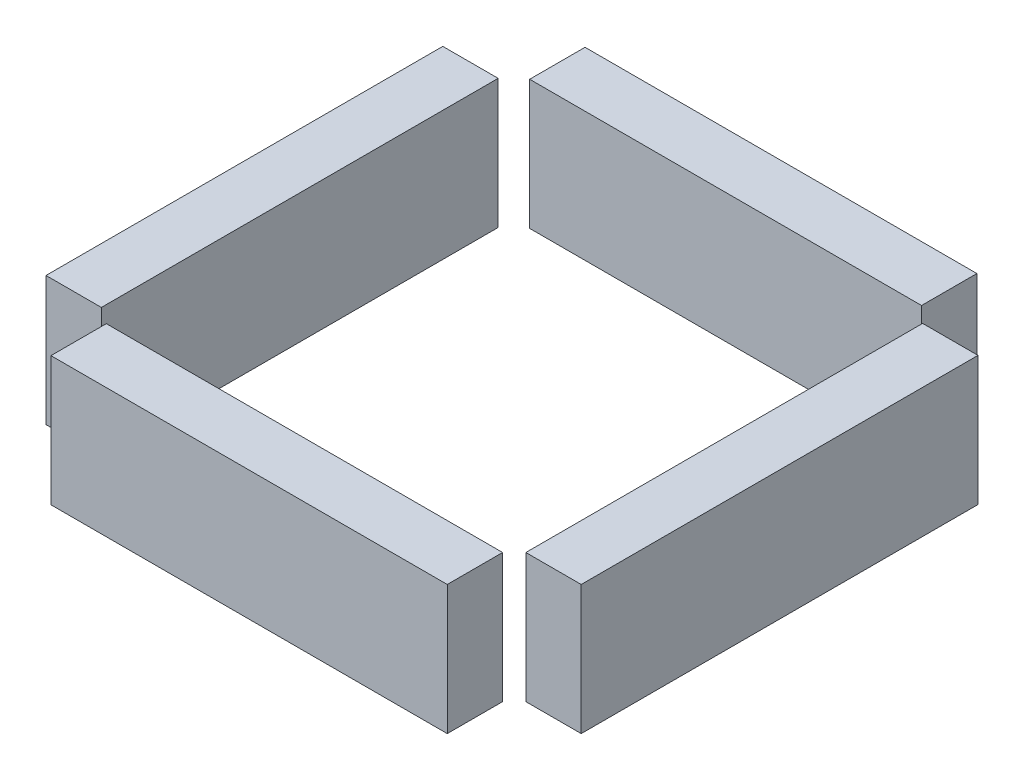
ISO-10303-21;
HEADER;
FILE_DESCRIPTION(('STEP AP214'),'2;1');
FILE_NAME('part.step','',(''),(''),'','','');
FILE_SCHEMA(('AUTOMOTIVE_DESIGN { 1 0 10303 214 1 1 1 1 }'));
ENDSEC;
DATA;
#1=APPLICATION_CONTEXT('core data for automotive mechanical design processes');
#2=APPLICATION_PROTOCOL_DEFINITION('international standard','automotive_design',2000,#1);
#3=PRODUCT_CONTEXT('',#1,'mechanical');
#4=PRODUCT('Part','Part','',(#3));
#5=PRODUCT_RELATED_PRODUCT_CATEGORY('part','',(#4));
#6=PRODUCT_DEFINITION_FORMATION('','',#4);
#7=PRODUCT_DEFINITION_CONTEXT('part definition',#1,'design');
#8=PRODUCT_DEFINITION('design','',#6,#7);
#9=PRODUCT_DEFINITION_SHAPE('','',#8);
#10=(LENGTH_UNIT() NAMED_UNIT(*) SI_UNIT(.MILLI.,.METRE.));
#11=(NAMED_UNIT(*) PLANE_ANGLE_UNIT() SI_UNIT($,.RADIAN.));
#12=(NAMED_UNIT(*) SI_UNIT($,.STERADIAN.) SOLID_ANGLE_UNIT());
#13=UNCERTAINTY_MEASURE_WITH_UNIT(LENGTH_MEASURE(1.E-05),#10,'distance_accuracy_value','');
#14=(GEOMETRIC_REPRESENTATION_CONTEXT(3) GLOBAL_UNCERTAINTY_ASSIGNED_CONTEXT((#13)) GLOBAL_UNIT_ASSIGNED_CONTEXT((#10,
#11,#12)) REPRESENTATION_CONTEXT('',''));
#15=CARTESIAN_POINT('',(0.,0.,0.));
#16=DIRECTION('',(0.,0.,1.));
#17=DIRECTION('',(1.,0.,0.));
#18=AXIS2_PLACEMENT_3D('',#15,#16,#17);
#19=CARTESIAN_POINT('',(45.5913386514758,14.,-76.0118904115382));
#20=DIRECTION('',(1.,0.,0.));
#21=DIRECTION('',(0.,0.,-1.));
#22=AXIS2_PLACEMENT_3D('',#19,#20,#21);
#23=PLANE('',#22);
#24=DIRECTION('',(0.,0.,1.));
#25=VECTOR('',#24,1.);
#26=CARTESIAN_POINT('',(45.5913386514758,0.,-76.0118904115382));
#27=LINE('',#26,#25);
#28=CARTESIAN_POINT('',(45.5913386514758,0.,-76.0118904115382));
#29=VERTEX_POINT('',#28);
#30=CARTESIAN_POINT('',(45.5913386514758,0.,-70.0118904115382));
#31=VERTEX_POINT('',#30);
#32=EDGE_CURVE('E107',#29,#31,#27,.T.);
#33=ORIENTED_EDGE('',*,*,#32,.T.);
#34=DIRECTION('',(0.,-1.,0.));
#35=VECTOR('',#34,1.);
#36=CARTESIAN_POINT('',(45.5913386514758,14.,-70.0118904115382));
#37=LINE('',#36,#35);
#38=CARTESIAN_POINT('',(45.5913386514758,14.,-70.0118904115382));
#39=VERTEX_POINT('',#38);
#40=EDGE_CURVE('E12',#39,#31,#37,.T.);
#41=ORIENTED_EDGE('',*,*,#40,.F.);
#42=DIRECTION('',(0.,0.,1.));
#43=VECTOR('',#42,1.);
#44=CARTESIAN_POINT('',(45.5913386514758,14.,-76.0118904115382));
#45=LINE('',#44,#43);
#46=CARTESIAN_POINT('',(45.5913386514758,14.,-76.0118904115382));
#47=VERTEX_POINT('',#46);
#48=EDGE_CURVE('E95',#47,#39,#45,.T.);
#49=ORIENTED_EDGE('',*,*,#48,.F.);
#50=DIRECTION('',(0.,-1.,0.));
#51=VECTOR('',#50,1.);
#52=CARTESIAN_POINT('',(45.5913386514758,14.,-76.0118904115382));
#53=LINE('',#52,#51);
#54=EDGE_CURVE('E103',#47,#29,#53,.T.);
#55=ORIENTED_EDGE('',*,*,#54,.T.);
#56=EDGE_LOOP('',(#33,#41,#49,#55));
#57=FACE_BOUND('',#56,.T.);
#58=ADVANCED_FACE('F44',(#57),#23,.F.);
#59=CARTESIAN_POINT('',(45.5913386514758,14.,-70.0118904115382));
#60=DIRECTION('',(0.,0.,-1.));
#61=DIRECTION('',(-1.,0.,0.));
#62=AXIS2_PLACEMENT_3D('',#59,#60,#61);
#63=PLANE('',#62);
#64=DIRECTION('',(1.,0.,0.));
#65=VECTOR('',#64,1.);
#66=CARTESIAN_POINT('',(45.5913386514758,0.,-70.0118904115382));
#67=LINE('',#66,#65);
#68=CARTESIAN_POINT('',(88.0565955094808,0.,-70.0118904115382));
#69=VERTEX_POINT('',#68);
#70=EDGE_CURVE('E99',#31,#69,#67,.T.);
#71=ORIENTED_EDGE('',*,*,#70,.T.);
#72=DIRECTION('',(0.,-1.,0.));
#73=VECTOR('',#72,1.);
#74=CARTESIAN_POINT('',(88.0565955094808,14.,-70.0118904115382));
#75=LINE('',#74,#73);
#76=CARTESIAN_POINT('',(88.0565955094808,14.,-70.0118904115382));
#77=VERTEX_POINT('',#76);
#78=EDGE_CURVE('E52',#77,#69,#75,.T.);
#79=ORIENTED_EDGE('',*,*,#78,.F.);
#80=DIRECTION('',(1.,0.,0.));
#81=VECTOR('',#80,1.);
#82=CARTESIAN_POINT('',(45.5913386514758,14.,-70.0118904115382));
#83=LINE('',#82,#81);
#84=EDGE_CURVE('E90',#39,#77,#83,.T.);
#85=ORIENTED_EDGE('',*,*,#84,.F.);
#86=ORIENTED_EDGE('',*,*,#40,.T.);
#87=EDGE_LOOP('',(#71,#79,#85,#86));
#88=FACE_BOUND('',#87,.T.);
#89=ADVANCED_FACE('F98',(#88),#63,.F.);
#90=CARTESIAN_POINT('',(88.0565955094808,14.,-76.0118904115382));
#91=DIRECTION('',(-1.,0.,0.));
#92=DIRECTION('',(0.,0.,1.));
#93=AXIS2_PLACEMENT_3D('',#90,#91,#92);
#94=PLANE('',#93);
#95=DIRECTION('',(0.,0.,-1.));
#96=VECTOR('',#95,1.);
#97=CARTESIAN_POINT('',(88.0565955094808,0.,-76.0118904115382));
#98=LINE('',#97,#96);
#99=CARTESIAN_POINT('',(88.0565955094808,0.,-76.0118904115382));
#100=VERTEX_POINT('',#99);
#101=EDGE_CURVE('E77',#69,#100,#98,.T.);
#102=ORIENTED_EDGE('',*,*,#101,.T.);
#103=DIRECTION('',(0.,-1.,0.));
#104=VECTOR('',#103,1.);
#105=CARTESIAN_POINT('',(88.0565955094808,14.,-76.0118904115382));
#106=LINE('',#105,#104);
#107=CARTESIAN_POINT('',(88.0565955094808,14.,-76.0118904115382));
#108=VERTEX_POINT('',#107);
#109=EDGE_CURVE('E100',#108,#100,#106,.T.);
#110=ORIENTED_EDGE('',*,*,#109,.F.);
#111=DIRECTION('',(0.,0.,-1.));
#112=VECTOR('',#111,1.);
#113=CARTESIAN_POINT('',(88.0565955094808,14.,-76.0118904115382));
#114=LINE('',#113,#112);
#115=EDGE_CURVE('E93',#77,#108,#114,.T.);
#116=ORIENTED_EDGE('',*,*,#115,.F.);
#117=ORIENTED_EDGE('',*,*,#78,.T.);
#118=EDGE_LOOP('',(#102,#110,#116,#117));
#119=FACE_BOUND('',#118,.T.);
#120=ADVANCED_FACE('F101',(#119),#94,.F.);
#121=CARTESIAN_POINT('',(45.5913386514758,14.,-76.0118904115382));
#122=DIRECTION('',(0.,0.,1.));
#123=DIRECTION('',(1.,0.,0.));
#124=AXIS2_PLACEMENT_3D('',#121,#122,#123);
#125=PLANE('',#124);
#126=DIRECTION('',(-1.,0.,0.));
#127=VECTOR('',#126,1.);
#128=CARTESIAN_POINT('',(45.5913386514758,0.,-76.0118904115382));
#129=LINE('',#128,#127);
#130=EDGE_CURVE('E83',#100,#29,#129,.T.);
#131=ORIENTED_EDGE('',*,*,#130,.T.);
#132=ORIENTED_EDGE('',*,*,#54,.F.);
#133=DIRECTION('',(-1.,0.,0.));
#134=VECTOR('',#133,1.);
#135=CARTESIAN_POINT('',(45.5913386514758,14.,-76.0118904115382));
#136=LINE('',#135,#134);
#137=EDGE_CURVE('E60',#108,#47,#136,.T.);
#138=ORIENTED_EDGE('',*,*,#137,.F.);
#139=ORIENTED_EDGE('',*,*,#109,.T.);
#140=EDGE_LOOP('',(#131,#132,#138,#139));
#141=FACE_BOUND('',#140,.T.);
#142=ADVANCED_FACE('F114',(#141),#125,.F.);
#143=CARTESIAN_POINT('',(45.5913386514758,14.,-70.0118904115382));
#144=DIRECTION('',(0.,1.,0.));
#145=DIRECTION('',(0.,0.,1.));
#146=AXIS2_PLACEMENT_3D('',#143,#144,#145);
#147=PLANE('',#146);
#148=ORIENTED_EDGE('',*,*,#48,.T.);
#149=ORIENTED_EDGE('',*,*,#84,.T.);
#150=ORIENTED_EDGE('',*,*,#115,.T.);
#151=ORIENTED_EDGE('',*,*,#137,.T.);
#152=EDGE_LOOP('',(#148,#149,#150,#151));
#153=FACE_BOUND('',#152,.T.);
#154=ADVANCED_FACE('F91',(#153),#147,.T.);
#155=CARTESIAN_POINT('',(45.5913386514758,0.,-70.0118904115382));
#156=DIRECTION('',(0.,1.,0.));
#157=DIRECTION('',(0.,0.,1.));
#158=AXIS2_PLACEMENT_3D('',#155,#156,#157);
#159=PLANE('',#158);
#160=ORIENTED_EDGE('',*,*,#32,.F.);
#161=ORIENTED_EDGE('',*,*,#130,.F.);
#162=ORIENTED_EDGE('',*,*,#101,.F.);
#163=ORIENTED_EDGE('',*,*,#70,.F.);
#164=EDGE_LOOP('',(#160,#161,#162,#163));
#165=FACE_BOUND('',#164,.T.);
#166=ADVANCED_FACE('F117',(#165),#159,.F.);
#167=CLOSED_SHELL('',(#58,#89,#120,#142,#154,#166));
#168=MANIFOLD_SOLID_BREP('B2',#167);
#169=CARTESIAN_POINT('',(45.5913386514758,14.,-24.1324555266718));
#170=DIRECTION('',(1.,0.,0.));
#171=DIRECTION('',(0.,0.,-1.));
#172=AXIS2_PLACEMENT_3D('',#169,#170,#171);
#173=PLANE('',#172);
#174=DIRECTION('',(0.,0.,1.));
#175=VECTOR('',#174,1.);
#176=CARTESIAN_POINT('',(45.5913386514758,0.,-24.1324555266718));
#177=LINE('',#176,#175);
#178=CARTESIAN_POINT('',(45.5913386514758,0.,-24.1324555266718));
#179=VERTEX_POINT('',#178);
#180=CARTESIAN_POINT('',(45.5913386514758,0.,-18.1324555266718));
#181=VERTEX_POINT('',#180);
#182=EDGE_CURVE('E241',#179,#181,#177,.T.);
#183=ORIENTED_EDGE('',*,*,#182,.T.);
#184=DIRECTION('',(0.,-1.,0.));
#185=VECTOR('',#184,1.);
#186=CARTESIAN_POINT('',(45.5913386514758,14.,-18.1324555266718));
#187=LINE('',#186,#185);
#188=CARTESIAN_POINT('',(45.5913386514758,14.,-18.1324555266718));
#189=VERTEX_POINT('',#188);
#190=EDGE_CURVE('E42',#189,#181,#187,.T.);
#191=ORIENTED_EDGE('',*,*,#190,.F.);
#192=DIRECTION('',(0.,0.,1.));
#193=VECTOR('',#192,1.);
#194=CARTESIAN_POINT('',(45.5913386514758,14.,-24.1324555266718));
#195=LINE('',#194,#193);
#196=CARTESIAN_POINT('',(45.5913386514758,14.,-24.1324555266718));
#197=VERTEX_POINT('',#196);
#198=EDGE_CURVE('E229',#197,#189,#195,.T.);
#199=ORIENTED_EDGE('',*,*,#198,.F.);
#200=DIRECTION('',(0.,-1.,0.));
#201=VECTOR('',#200,1.);
#202=CARTESIAN_POINT('',(45.5913386514758,14.,-24.1324555266718));
#203=LINE('',#202,#201);
#204=EDGE_CURVE('E237',#197,#179,#203,.T.);
#205=ORIENTED_EDGE('',*,*,#204,.T.);
#206=EDGE_LOOP('',(#183,#191,#199,#205));
#207=FACE_BOUND('',#206,.T.);
#208=ADVANCED_FACE('F178',(#207),#173,.F.);
#209=CARTESIAN_POINT('',(45.5913386514758,14.,-18.1324555266718));
#210=DIRECTION('',(0.,0.,-1.));
#211=DIRECTION('',(-1.,0.,0.));
#212=AXIS2_PLACEMENT_3D('',#209,#210,#211);
#213=PLANE('',#212);
#214=DIRECTION('',(1.,0.,0.));
#215=VECTOR('',#214,1.);
#216=CARTESIAN_POINT('',(45.5913386514758,0.,-18.1324555266718));
#217=LINE('',#216,#215);
#218=CARTESIAN_POINT('',(88.5391552465036,0.,-18.1324555266718));
#219=VERTEX_POINT('',#218);
#220=EDGE_CURVE('E233',#181,#219,#217,.T.);
#221=ORIENTED_EDGE('',*,*,#220,.T.);
#222=DIRECTION('',(0.,-1.,0.));
#223=VECTOR('',#222,1.);
#224=CARTESIAN_POINT('',(88.5391552465036,14.,-18.1324555266718));
#225=LINE('',#224,#223);
#226=CARTESIAN_POINT('',(88.5391552465036,14.,-18.1324555266718));
#227=VERTEX_POINT('',#226);
#228=EDGE_CURVE('E186',#227,#219,#225,.T.);
#229=ORIENTED_EDGE('',*,*,#228,.F.);
#230=DIRECTION('',(1.,0.,0.));
#231=VECTOR('',#230,1.);
#232=CARTESIAN_POINT('',(45.5913386514758,14.,-18.1324555266718));
#233=LINE('',#232,#231);
#234=EDGE_CURVE('E224',#189,#227,#233,.T.);
#235=ORIENTED_EDGE('',*,*,#234,.F.);
#236=ORIENTED_EDGE('',*,*,#190,.T.);
#237=EDGE_LOOP('',(#221,#229,#235,#236));
#238=FACE_BOUND('',#237,.T.);
#239=ADVANCED_FACE('F232',(#238),#213,.F.);
#240=CARTESIAN_POINT('',(88.5391552465036,14.,-24.1324555266718));
#241=DIRECTION('',(-1.,0.,0.));
#242=DIRECTION('',(0.,0.,1.));
#243=AXIS2_PLACEMENT_3D('',#240,#241,#242);
#244=PLANE('',#243);
#245=DIRECTION('',(0.,0.,-1.));
#246=VECTOR('',#245,1.);
#247=CARTESIAN_POINT('',(88.5391552465036,0.,-24.1324555266718));
#248=LINE('',#247,#246);
#249=CARTESIAN_POINT('',(88.5391552465036,0.,-24.1324555266718));
#250=VERTEX_POINT('',#249);
#251=EDGE_CURVE('E211',#219,#250,#248,.T.);
#252=ORIENTED_EDGE('',*,*,#251,.T.);
#253=DIRECTION('',(0.,-1.,0.));
#254=VECTOR('',#253,1.);
#255=CARTESIAN_POINT('',(88.5391552465036,14.,-24.1324555266718));
#256=LINE('',#255,#254);
#257=CARTESIAN_POINT('',(88.5391552465036,14.,-24.1324555266718));
#258=VERTEX_POINT('',#257);
#259=EDGE_CURVE('E234',#258,#250,#256,.T.);
#260=ORIENTED_EDGE('',*,*,#259,.F.);
#261=DIRECTION('',(0.,0.,-1.));
#262=VECTOR('',#261,1.);
#263=CARTESIAN_POINT('',(88.5391552465036,14.,-24.1324555266718));
#264=LINE('',#263,#262);
#265=EDGE_CURVE('E227',#227,#258,#264,.T.);
#266=ORIENTED_EDGE('',*,*,#265,.F.);
#267=ORIENTED_EDGE('',*,*,#228,.T.);
#268=EDGE_LOOP('',(#252,#260,#266,#267));
#269=FACE_BOUND('',#268,.T.);
#270=ADVANCED_FACE('F235',(#269),#244,.F.);
#271=CARTESIAN_POINT('',(45.5913386514758,14.,-24.1324555266718));
#272=DIRECTION('',(0.,0.,1.));
#273=DIRECTION('',(1.,0.,0.));
#274=AXIS2_PLACEMENT_3D('',#271,#272,#273);
#275=PLANE('',#274);
#276=DIRECTION('',(-1.,0.,0.));
#277=VECTOR('',#276,1.);
#278=CARTESIAN_POINT('',(45.5913386514758,0.,-24.1324555266718));
#279=LINE('',#278,#277);
#280=EDGE_CURVE('E217',#250,#179,#279,.T.);
#281=ORIENTED_EDGE('',*,*,#280,.T.);
#282=ORIENTED_EDGE('',*,*,#204,.F.);
#283=DIRECTION('',(-1.,0.,0.));
#284=VECTOR('',#283,1.);
#285=CARTESIAN_POINT('',(45.5913386514758,14.,-24.1324555266718));
#286=LINE('',#285,#284);
#287=EDGE_CURVE('E194',#258,#197,#286,.T.);
#288=ORIENTED_EDGE('',*,*,#287,.F.);
#289=ORIENTED_EDGE('',*,*,#259,.T.);
#290=EDGE_LOOP('',(#281,#282,#288,#289));
#291=FACE_BOUND('',#290,.T.);
#292=ADVANCED_FACE('F248',(#291),#275,.F.);
#293=CARTESIAN_POINT('',(45.5913386514758,14.,-18.1324555266718));
#294=DIRECTION('',(0.,1.,0.));
#295=DIRECTION('',(0.,0.,1.));
#296=AXIS2_PLACEMENT_3D('',#293,#294,#295);
#297=PLANE('',#296);
#298=ORIENTED_EDGE('',*,*,#198,.T.);
#299=ORIENTED_EDGE('',*,*,#234,.T.);
#300=ORIENTED_EDGE('',*,*,#265,.T.);
#301=ORIENTED_EDGE('',*,*,#287,.T.);
#302=EDGE_LOOP('',(#298,#299,#300,#301));
#303=FACE_BOUND('',#302,.T.);
#304=ADVANCED_FACE('F225',(#303),#297,.T.);
#305=CARTESIAN_POINT('',(45.5913386514758,0.,-18.1324555266718));
#306=DIRECTION('',(0.,1.,0.));
#307=DIRECTION('',(0.,0.,1.));
#308=AXIS2_PLACEMENT_3D('',#305,#306,#307);
#309=PLANE('',#308);
#310=ORIENTED_EDGE('',*,*,#182,.F.);
#311=ORIENTED_EDGE('',*,*,#280,.F.);
#312=ORIENTED_EDGE('',*,*,#251,.F.);
#313=ORIENTED_EDGE('',*,*,#220,.F.);
#314=EDGE_LOOP('',(#310,#311,#312,#313));
#315=FACE_BOUND('',#314,.T.);
#316=ADVANCED_FACE('F251',(#315),#309,.F.);
#317=CLOSED_SHELL('',(#208,#239,#270,#292,#304,#316));
#318=MANIFOLD_SOLID_BREP('B6',#317);
#319=CARTESIAN_POINT('',(37.7979848825846,14.,-25.3901368937506));
#320=DIRECTION('',(1.,0.,0.));
#321=DIRECTION('',(0.,0.,-1.));
#322=AXIS2_PLACEMENT_3D('',#319,#320,#321);
#323=PLANE('',#322);
#324=DIRECTION('',(0.,0.,1.));
#325=VECTOR('',#324,1.);
#326=CARTESIAN_POINT('',(37.7979848825846,0.,-25.3901368937506));
#327=LINE('',#326,#325);
#328=CARTESIAN_POINT('',(37.7979848825846,0.,-68.3901368937506));
#329=VERTEX_POINT('',#328);
#330=CARTESIAN_POINT('',(37.7979848825846,0.,-25.3901368937506));
#331=VERTEX_POINT('',#330);
#332=EDGE_CURVE('E374',#329,#331,#327,.T.);
#333=ORIENTED_EDGE('',*,*,#332,.T.);
#334=DIRECTION('',(0.,-1.,0.));
#335=VECTOR('',#334,1.);
#336=CARTESIAN_POINT('',(37.7979848825846,14.,-25.3901368937506));
#337=LINE('',#336,#335);
#338=CARTESIAN_POINT('',(37.7979848825846,14.,-25.3901368937506));
#339=VERTEX_POINT('',#338);
#340=EDGE_CURVE('E176',#339,#331,#337,.T.);
#341=ORIENTED_EDGE('',*,*,#340,.F.);
#342=DIRECTION('',(0.,0.,1.));
#343=VECTOR('',#342,1.);
#344=CARTESIAN_POINT('',(37.7979848825846,14.,-25.3901368937506));
#345=LINE('',#344,#343);
#346=CARTESIAN_POINT('',(37.7979848825846,14.,-68.3901368937506));
#347=VERTEX_POINT('',#346);
#348=EDGE_CURVE('E362',#347,#339,#345,.T.);
#349=ORIENTED_EDGE('',*,*,#348,.F.);
#350=DIRECTION('',(0.,-1.,0.));
#351=VECTOR('',#350,1.);
#352=CARTESIAN_POINT('',(37.7979848825846,14.,-68.3901368937506));
#353=LINE('',#352,#351);
#354=EDGE_CURVE('E370',#347,#329,#353,.T.);
#355=ORIENTED_EDGE('',*,*,#354,.T.);
#356=EDGE_LOOP('',(#333,#341,#349,#355));
#357=FACE_BOUND('',#356,.T.);
#358=ADVANCED_FACE('F311',(#357),#323,.F.);
#359=CARTESIAN_POINT('',(37.7979848825846,14.,-25.3901368937506));
#360=DIRECTION('',(0.,0.,-1.));
#361=DIRECTION('',(-1.,0.,0.));
#362=AXIS2_PLACEMENT_3D('',#359,#360,#361);
#363=PLANE('',#362);
#364=DIRECTION('',(1.,0.,0.));
#365=VECTOR('',#364,1.);
#366=CARTESIAN_POINT('',(37.7979848825846,0.,-25.3901368937506));
#367=LINE('',#366,#365);
#368=CARTESIAN_POINT('',(43.7979848825846,0.,-25.3901368937506));
#369=VERTEX_POINT('',#368);
#370=EDGE_CURVE('E366',#331,#369,#367,.T.);
#371=ORIENTED_EDGE('',*,*,#370,.T.);
#372=DIRECTION('',(0.,-1.,0.));
#373=VECTOR('',#372,1.);
#374=CARTESIAN_POINT('',(43.7979848825846,14.,-25.3901368937506));
#375=LINE('',#374,#373);
#376=CARTESIAN_POINT('',(43.7979848825846,14.,-25.3901368937506));
#377=VERTEX_POINT('',#376);
#378=EDGE_CURVE('E319',#377,#369,#375,.T.);
#379=ORIENTED_EDGE('',*,*,#378,.F.);
#380=DIRECTION('',(1.,0.,0.));
#381=VECTOR('',#380,1.);
#382=CARTESIAN_POINT('',(37.7979848825846,14.,-25.3901368937506));
#383=LINE('',#382,#381);
#384=EDGE_CURVE('E357',#339,#377,#383,.T.);
#385=ORIENTED_EDGE('',*,*,#384,.F.);
#386=ORIENTED_EDGE('',*,*,#340,.T.);
#387=EDGE_LOOP('',(#371,#379,#385,#386));
#388=FACE_BOUND('',#387,.T.);
#389=ADVANCED_FACE('F365',(#388),#363,.F.);
#390=CARTESIAN_POINT('',(43.7979848825846,14.,-25.3901368937506));
#391=DIRECTION('',(-1.,0.,0.));
#392=DIRECTION('',(0.,0.,1.));
#393=AXIS2_PLACEMENT_3D('',#390,#391,#392);
#394=PLANE('',#393);
#395=DIRECTION('',(0.,0.,-1.));
#396=VECTOR('',#395,1.);
#397=CARTESIAN_POINT('',(43.7979848825846,0.,-25.3901368937506));
#398=LINE('',#397,#396);
#399=CARTESIAN_POINT('',(43.7979848825846,0.,-68.3901368937506));
#400=VERTEX_POINT('',#399);
#401=EDGE_CURVE('E344',#369,#400,#398,.T.);
#402=ORIENTED_EDGE('',*,*,#401,.T.);
#403=DIRECTION('',(0.,-1.,0.));
#404=VECTOR('',#403,1.);
#405=CARTESIAN_POINT('',(43.7979848825846,14.,-68.3901368937506));
#406=LINE('',#405,#404);
#407=CARTESIAN_POINT('',(43.7979848825846,14.,-68.3901368937506));
#408=VERTEX_POINT('',#407);
#409=EDGE_CURVE('E367',#408,#400,#406,.T.);
#410=ORIENTED_EDGE('',*,*,#409,.F.);
#411=DIRECTION('',(0.,0.,-1.));
#412=VECTOR('',#411,1.);
#413=CARTESIAN_POINT('',(43.7979848825846,14.,-25.3901368937506));
#414=LINE('',#413,#412);
#415=EDGE_CURVE('E360',#377,#408,#414,.T.);
#416=ORIENTED_EDGE('',*,*,#415,.F.);
#417=ORIENTED_EDGE('',*,*,#378,.T.);
#418=EDGE_LOOP('',(#402,#410,#416,#417));
#419=FACE_BOUND('',#418,.T.);
#420=ADVANCED_FACE('F368',(#419),#394,.F.);
#421=CARTESIAN_POINT('',(37.7979848825846,14.,-68.3901368937506));
#422=DIRECTION('',(0.,0.,1.));
#423=DIRECTION('',(1.,0.,0.));
#424=AXIS2_PLACEMENT_3D('',#421,#422,#423);
#425=PLANE('',#424);
#426=DIRECTION('',(-1.,0.,0.));
#427=VECTOR('',#426,1.);
#428=CARTESIAN_POINT('',(37.7979848825846,0.,-68.3901368937506));
#429=LINE('',#428,#427);
#430=EDGE_CURVE('E350',#400,#329,#429,.T.);
#431=ORIENTED_EDGE('',*,*,#430,.T.);
#432=ORIENTED_EDGE('',*,*,#354,.F.);
#433=DIRECTION('',(-1.,0.,0.));
#434=VECTOR('',#433,1.);
#435=CARTESIAN_POINT('',(37.7979848825846,14.,-68.3901368937506));
#436=LINE('',#435,#434);
#437=EDGE_CURVE('E327',#408,#347,#436,.T.);
#438=ORIENTED_EDGE('',*,*,#437,.F.);
#439=ORIENTED_EDGE('',*,*,#409,.T.);
#440=EDGE_LOOP('',(#431,#432,#438,#439));
#441=FACE_BOUND('',#440,.T.);
#442=ADVANCED_FACE('F381',(#441),#425,.F.);
#443=CARTESIAN_POINT('',(37.7979848825846,14.,-68.3901368937506));
#444=DIRECTION('',(0.,-1.,0.));
#445=DIRECTION('',(0.,0.,-1.));
#446=AXIS2_PLACEMENT_3D('',#443,#444,#445);
#447=PLANE('',#446);
#448=ORIENTED_EDGE('',*,*,#348,.T.);
#449=ORIENTED_EDGE('',*,*,#384,.T.);
#450=ORIENTED_EDGE('',*,*,#415,.T.);
#451=ORIENTED_EDGE('',*,*,#437,.T.);
#452=EDGE_LOOP('',(#448,#449,#450,#451));
#453=FACE_BOUND('',#452,.T.);
#454=ADVANCED_FACE('F358',(#453),#447,.F.);
#455=CARTESIAN_POINT('',(37.7979848825846,0.,-68.3901368937506));
#456=DIRECTION('',(0.,-1.,0.));
#457=DIRECTION('',(0.,0.,-1.));
#458=AXIS2_PLACEMENT_3D('',#455,#456,#457);
#459=PLANE('',#458);
#460=ORIENTED_EDGE('',*,*,#332,.F.);
#461=ORIENTED_EDGE('',*,*,#430,.F.);
#462=ORIENTED_EDGE('',*,*,#401,.F.);
#463=ORIENTED_EDGE('',*,*,#370,.F.);
#464=EDGE_LOOP('',(#460,#461,#462,#463));
#465=FACE_BOUND('',#464,.T.);
#466=ADVANCED_FACE('F384',(#465),#459,.T.);
#467=CLOSED_SHELL('',(#358,#389,#420,#442,#454,#466));
#468=MANIFOLD_SOLID_BREP('B36',#467);
#469=CARTESIAN_POINT('',(89.7979848825846,14.,-25.3901368937509));
#470=DIRECTION('',(1.,0.,0.));
#471=DIRECTION('',(0.,0.,-1.));
#472=AXIS2_PLACEMENT_3D('',#469,#470,#471);
#473=PLANE('',#472);
#474=DIRECTION('',(0.,0.,1.));
#475=VECTOR('',#474,1.);
#476=CARTESIAN_POINT('',(89.7979848825846,0.,-25.3901368937509));
#477=LINE('',#476,#475);
#478=CARTESIAN_POINT('',(89.7979848825846,0.,-68.3901368937509));
#479=VERTEX_POINT('',#478);
#480=CARTESIAN_POINT('',(89.7979848825846,0.,-25.3901368937509));
#481=VERTEX_POINT('',#480);
#482=EDGE_CURVE('E498',#479,#481,#477,.T.);
#483=ORIENTED_EDGE('',*,*,#482,.T.);
#484=DIRECTION('',(0.,-1.,0.));
#485=VECTOR('',#484,1.);
#486=CARTESIAN_POINT('',(89.7979848825846,14.,-25.3901368937509));
#487=LINE('',#486,#485);
#488=CARTESIAN_POINT('',(89.7979848825846,14.,-25.3901368937509));
#489=VERTEX_POINT('',#488);
#490=EDGE_CURVE('E309',#489,#481,#487,.T.);
#491=ORIENTED_EDGE('',*,*,#490,.F.);
#492=DIRECTION('',(0.,0.,1.));
#493=VECTOR('',#492,1.);
#494=CARTESIAN_POINT('',(89.7979848825846,14.,-25.3901368937509));
#495=LINE('',#494,#493);
#496=CARTESIAN_POINT('',(89.7979848825846,14.,-68.3901368937509));
#497=VERTEX_POINT('',#496);
#498=EDGE_CURVE('E486',#497,#489,#495,.T.);
#499=ORIENTED_EDGE('',*,*,#498,.F.);
#500=DIRECTION('',(0.,-1.,0.));
#501=VECTOR('',#500,1.);
#502=CARTESIAN_POINT('',(89.7979848825846,14.,-68.3901368937509));
#503=LINE('',#502,#501);
#504=EDGE_CURVE('E494',#497,#479,#503,.T.);
#505=ORIENTED_EDGE('',*,*,#504,.T.);
#506=EDGE_LOOP('',(#483,#491,#499,#505));
#507=FACE_BOUND('',#506,.T.);
#508=ADVANCED_FACE('F435',(#507),#473,.F.);
#509=CARTESIAN_POINT('',(89.7979848825846,14.,-25.3901368937509));
#510=DIRECTION('',(0.,0.,-1.));
#511=DIRECTION('',(-1.,0.,0.));
#512=AXIS2_PLACEMENT_3D('',#509,#510,#511);
#513=PLANE('',#512);
#514=DIRECTION('',(1.,0.,0.));
#515=VECTOR('',#514,1.);
#516=CARTESIAN_POINT('',(89.7979848825846,0.,-25.3901368937509));
#517=LINE('',#516,#515);
#518=CARTESIAN_POINT('',(95.7979848825846,0.,-25.3901368937509));
#519=VERTEX_POINT('',#518);
#520=EDGE_CURVE('E490',#481,#519,#517,.T.);
#521=ORIENTED_EDGE('',*,*,#520,.T.);
#522=DIRECTION('',(0.,-1.,0.));
#523=VECTOR('',#522,1.);
#524=CARTESIAN_POINT('',(95.7979848825846,14.,-25.3901368937509));
#525=LINE('',#524,#523);
#526=CARTESIAN_POINT('',(95.7979848825846,14.,-25.3901368937509));
#527=VERTEX_POINT('',#526);
#528=EDGE_CURVE('E443',#527,#519,#525,.T.);
#529=ORIENTED_EDGE('',*,*,#528,.F.);
#530=DIRECTION('',(1.,0.,0.));
#531=VECTOR('',#530,1.);
#532=CARTESIAN_POINT('',(89.7979848825846,14.,-25.3901368937509));
#533=LINE('',#532,#531);
#534=EDGE_CURVE('E481',#489,#527,#533,.T.);
#535=ORIENTED_EDGE('',*,*,#534,.F.);
#536=ORIENTED_EDGE('',*,*,#490,.T.);
#537=EDGE_LOOP('',(#521,#529,#535,#536));
#538=FACE_BOUND('',#537,.T.);
#539=ADVANCED_FACE('F489',(#538),#513,.F.);
#540=CARTESIAN_POINT('',(95.7979848825846,14.,-25.3901368937509));
#541=DIRECTION('',(-1.,0.,0.));
#542=DIRECTION('',(0.,0.,1.));
#543=AXIS2_PLACEMENT_3D('',#540,#541,#542);
#544=PLANE('',#543);
#545=DIRECTION('',(0.,0.,-1.));
#546=VECTOR('',#545,1.);
#547=CARTESIAN_POINT('',(95.7979848825846,0.,-25.3901368937509));
#548=LINE('',#547,#546);
#549=CARTESIAN_POINT('',(95.7979848825846,0.,-68.3901368937509));
#550=VERTEX_POINT('',#549);
#551=EDGE_CURVE('E468',#519,#550,#548,.T.);
#552=ORIENTED_EDGE('',*,*,#551,.T.);
#553=DIRECTION('',(0.,-1.,0.));
#554=VECTOR('',#553,1.);
#555=CARTESIAN_POINT('',(95.7979848825846,14.,-68.3901368937509));
#556=LINE('',#555,#554);
#557=CARTESIAN_POINT('',(95.7979848825846,14.,-68.3901368937509));
#558=VERTEX_POINT('',#557);
#559=EDGE_CURVE('E491',#558,#550,#556,.T.);
#560=ORIENTED_EDGE('',*,*,#559,.F.);
#561=DIRECTION('',(0.,0.,-1.));
#562=VECTOR('',#561,1.);
#563=CARTESIAN_POINT('',(95.7979848825846,14.,-25.3901368937509));
#564=LINE('',#563,#562);
#565=EDGE_CURVE('E484',#527,#558,#564,.T.);
#566=ORIENTED_EDGE('',*,*,#565,.F.);
#567=ORIENTED_EDGE('',*,*,#528,.T.);
#568=EDGE_LOOP('',(#552,#560,#566,#567));
#569=FACE_BOUND('',#568,.T.);
#570=ADVANCED_FACE('F492',(#569),#544,.F.);
#571=CARTESIAN_POINT('',(89.7979848825846,14.,-68.3901368937509));
#572=DIRECTION('',(0.,0.,1.));
#573=DIRECTION('',(1.,0.,0.));
#574=AXIS2_PLACEMENT_3D('',#571,#572,#573);
#575=PLANE('',#574);
#576=DIRECTION('',(-1.,0.,0.));
#577=VECTOR('',#576,1.);
#578=CARTESIAN_POINT('',(89.7979848825846,0.,-68.3901368937509));
#579=LINE('',#578,#577);
#580=EDGE_CURVE('E474',#550,#479,#579,.T.);
#581=ORIENTED_EDGE('',*,*,#580,.T.);
#582=ORIENTED_EDGE('',*,*,#504,.F.);
#583=DIRECTION('',(-1.,0.,0.));
#584=VECTOR('',#583,1.);
#585=CARTESIAN_POINT('',(89.7979848825846,14.,-68.3901368937509));
#586=LINE('',#585,#584);
#587=EDGE_CURVE('E451',#558,#497,#586,.T.);
#588=ORIENTED_EDGE('',*,*,#587,.F.);
#589=ORIENTED_EDGE('',*,*,#559,.T.);
#590=EDGE_LOOP('',(#581,#582,#588,#589));
#591=FACE_BOUND('',#590,.T.);
#592=ADVANCED_FACE('F505',(#591),#575,.F.);
#593=CARTESIAN_POINT('',(89.7979848825846,14.,-68.3901368937509));
#594=DIRECTION('',(0.,-1.,0.));
#595=DIRECTION('',(0.,0.,-1.));
#596=AXIS2_PLACEMENT_3D('',#593,#594,#595);
#597=PLANE('',#596);
#598=ORIENTED_EDGE('',*,*,#498,.T.);
#599=ORIENTED_EDGE('',*,*,#534,.T.);
#600=ORIENTED_EDGE('',*,*,#565,.T.);
#601=ORIENTED_EDGE('',*,*,#587,.T.);
#602=EDGE_LOOP('',(#598,#599,#600,#601));
#603=FACE_BOUND('',#602,.T.);
#604=ADVANCED_FACE('F482',(#603),#597,.F.);
#605=CARTESIAN_POINT('',(89.7979848825846,0.,-68.3901368937509));
#606=DIRECTION('',(0.,-1.,0.));
#607=DIRECTION('',(0.,0.,-1.));
#608=AXIS2_PLACEMENT_3D('',#605,#606,#607);
#609=PLANE('',#608);
#610=ORIENTED_EDGE('',*,*,#482,.F.);
#611=ORIENTED_EDGE('',*,*,#580,.F.);
#612=ORIENTED_EDGE('',*,*,#551,.F.);
#613=ORIENTED_EDGE('',*,*,#520,.F.);
#614=EDGE_LOOP('',(#610,#611,#612,#613));
#615=FACE_BOUND('',#614,.T.);
#616=ADVANCED_FACE('F508',(#615),#609,.T.);
#617=CLOSED_SHELL('',(#508,#539,#570,#592,#604,#616));
#618=MANIFOLD_SOLID_BREP('B170',#617);
#619=ADVANCED_BREP_SHAPE_REPRESENTATION('',(#18,#168,#318,#468,#618),#14);
#620=SHAPE_DEFINITION_REPRESENTATION(#9,#619);
ENDSEC;
END-ISO-10303-21;
